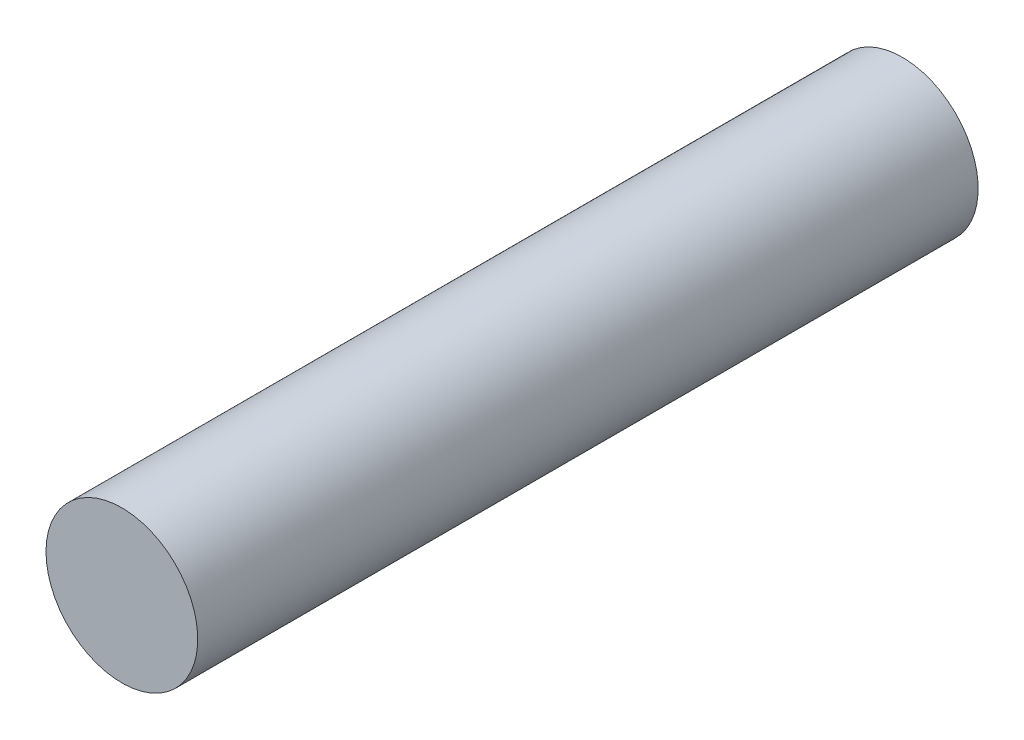
ISO-10303-21;
HEADER;
FILE_DESCRIPTION(('STEP AP214'),'2;1');
FILE_NAME('part.step','',(''),(''),'','','');
FILE_SCHEMA(('AUTOMOTIVE_DESIGN { 1 0 10303 214 1 1 1 1 }'));
ENDSEC;
DATA;
#1=APPLICATION_CONTEXT('core data for automotive mechanical design processes');
#2=APPLICATION_PROTOCOL_DEFINITION('international standard','automotive_design',2000,#1);
#3=PRODUCT_CONTEXT('',#1,'mechanical');
#4=PRODUCT('Part','Part','',(#3));
#5=PRODUCT_RELATED_PRODUCT_CATEGORY('part','',(#4));
#6=PRODUCT_DEFINITION_FORMATION('','',#4);
#7=PRODUCT_DEFINITION_CONTEXT('part definition',#1,'design');
#8=PRODUCT_DEFINITION('design','',#6,#7);
#9=PRODUCT_DEFINITION_SHAPE('','',#8);
#10=(LENGTH_UNIT() NAMED_UNIT(*) SI_UNIT(.MILLI.,.METRE.));
#11=(NAMED_UNIT(*) PLANE_ANGLE_UNIT() SI_UNIT($,.RADIAN.));
#12=(NAMED_UNIT(*) SI_UNIT($,.STERADIAN.) SOLID_ANGLE_UNIT());
#13=UNCERTAINTY_MEASURE_WITH_UNIT(LENGTH_MEASURE(1.E-05),#10,'distance_accuracy_value','');
#14=(GEOMETRIC_REPRESENTATION_CONTEXT(3) GLOBAL_UNCERTAINTY_ASSIGNED_CONTEXT((#13)) GLOBAL_UNIT_ASSIGNED_CONTEXT((#10,
#11,#12)) REPRESENTATION_CONTEXT('',''));
#15=CARTESIAN_POINT('',(0.,0.,0.));
#16=DIRECTION('',(0.,0.,1.));
#17=DIRECTION('',(1.,0.,0.));
#18=AXIS2_PLACEMENT_3D('',#15,#16,#17);
#19=CARTESIAN_POINT('',(0.,0.,180.));
#20=DIRECTION('',(0.,0.,-1.));
#21=DIRECTION('',(-1.,0.,0.));
#22=AXIS2_PLACEMENT_3D('',#19,#20,#21);
#23=CYLINDRICAL_SURFACE('',#22,17.5);
#24=CARTESIAN_POINT('',(0.,0.,180.));
#25=DIRECTION('',(0.,0.,1.));
#26=DIRECTION('',(1.,0.,0.));
#27=AXIS2_PLACEMENT_3D('',#24,#25,#26);
#28=CIRCLE('',#27,17.5);
#29=CARTESIAN_POINT('',(-17.5,0.,180.));
#30=VERTEX_POINT('',#29);
#31=EDGE_CURVE('E10',#30,#30,#28,.T.);
#32=CARTESIAN_POINT('',(0.,0.,0.));
#33=DIRECTION('',(0.,0.,1.));
#34=DIRECTION('',(1.,0.,0.));
#35=AXIS2_PLACEMENT_3D('',#32,#33,#34);
#36=CIRCLE('',#35,17.5);
#37=CARTESIAN_POINT('',(-17.5,0.,0.));
#38=VERTEX_POINT('',#37);
#39=EDGE_CURVE('E46',#38,#38,#36,.T.);
#40=CARTESIAN_POINT('',(-17.5,0.,180.));
#41=CARTESIAN_POINT('',(-17.5,0.,178.125));
#42=CARTESIAN_POINT('',(-17.5,0.,176.25));
#43=CARTESIAN_POINT('',(-17.5,0.,172.5));
#44=CARTESIAN_POINT('',(-17.5,0.,170.625));
#45=CARTESIAN_POINT('',(-17.5,0.,166.875));
#46=CARTESIAN_POINT('',(-17.5,0.,165.));
#47=CARTESIAN_POINT('',(-17.5,0.,161.25));
#48=CARTESIAN_POINT('',(-17.5,0.,159.375));
#49=CARTESIAN_POINT('',(-17.5,0.,155.625));
#50=CARTESIAN_POINT('',(-17.5,0.,153.75));
#51=CARTESIAN_POINT('',(-17.5,0.,150.));
#52=CARTESIAN_POINT('',(-17.5,0.,148.125));
#53=CARTESIAN_POINT('',(-17.5,0.,144.375));
#54=CARTESIAN_POINT('',(-17.5,0.,142.5));
#55=CARTESIAN_POINT('',(-17.5,0.,138.75));
#56=CARTESIAN_POINT('',(-17.5,0.,136.875));
#57=CARTESIAN_POINT('',(-17.5,0.,133.125));
#58=CARTESIAN_POINT('',(-17.5,0.,131.25));
#59=CARTESIAN_POINT('',(-17.5,0.,127.5));
#60=CARTESIAN_POINT('',(-17.5,0.,125.625));
#61=CARTESIAN_POINT('',(-17.5,0.,121.875));
#62=CARTESIAN_POINT('',(-17.5,0.,120.));
#63=CARTESIAN_POINT('',(-17.5,0.,116.25));
#64=CARTESIAN_POINT('',(-17.5,0.,114.375));
#65=CARTESIAN_POINT('',(-17.5,0.,110.625));
#66=CARTESIAN_POINT('',(-17.5,0.,108.75));
#67=CARTESIAN_POINT('',(-17.5,0.,105.));
#68=CARTESIAN_POINT('',(-17.5,0.,103.125));
#69=CARTESIAN_POINT('',(-17.5,0.,99.375));
#70=CARTESIAN_POINT('',(-17.5,0.,97.5));
#71=CARTESIAN_POINT('',(-17.5,0.,93.75));
#72=CARTESIAN_POINT('',(-17.5,0.,91.875));
#73=CARTESIAN_POINT('',(-17.5,0.,88.125));
#74=CARTESIAN_POINT('',(-17.5,0.,86.25));
#75=CARTESIAN_POINT('',(-17.5,0.,82.5));
#76=CARTESIAN_POINT('',(-17.5,0.,80.625));
#77=CARTESIAN_POINT('',(-17.5,0.,76.875));
#78=CARTESIAN_POINT('',(-17.5,0.,75.));
#79=CARTESIAN_POINT('',(-17.5,0.,71.25));
#80=CARTESIAN_POINT('',(-17.5,0.,69.375));
#81=CARTESIAN_POINT('',(-17.5,0.,65.625));
#82=CARTESIAN_POINT('',(-17.5,0.,63.75));
#83=CARTESIAN_POINT('',(-17.5,0.,60.));
#84=CARTESIAN_POINT('',(-17.5,0.,58.125));
#85=CARTESIAN_POINT('',(-17.5,0.,54.375));
#86=CARTESIAN_POINT('',(-17.5,0.,52.5));
#87=CARTESIAN_POINT('',(-17.5,0.,48.75));
#88=CARTESIAN_POINT('',(-17.5,0.,46.875));
#89=CARTESIAN_POINT('',(-17.5,0.,43.125));
#90=CARTESIAN_POINT('',(-17.5,0.,41.25));
#91=CARTESIAN_POINT('',(-17.5,0.,37.5));
#92=CARTESIAN_POINT('',(-17.5,0.,35.625));
#93=CARTESIAN_POINT('',(-17.5,0.,31.875));
#94=CARTESIAN_POINT('',(-17.5,0.,30.));
#95=CARTESIAN_POINT('',(-17.5,0.,26.25));
#96=CARTESIAN_POINT('',(-17.5,0.,24.375));
#97=CARTESIAN_POINT('',(-17.5,0.,20.625));
#98=CARTESIAN_POINT('',(-17.5,0.,18.75));
#99=CARTESIAN_POINT('',(-17.5,0.,15.));
#100=CARTESIAN_POINT('',(-17.5,0.,13.125));
#101=CARTESIAN_POINT('',(-17.5,0.,9.37499999999998));
#102=CARTESIAN_POINT('',(-17.5,0.,7.49999999999997));
#103=CARTESIAN_POINT('',(-17.5,0.,3.74999999999997));
#104=CARTESIAN_POINT('',(-17.5,0.,1.87499999999997));
#105=CARTESIAN_POINT('',(-17.5,0.,0.));
#106=B_SPLINE_CURVE_WITH_KNOTS('',3,(#40,#41,#42,#43,#44,#45,#46,#47,#48,#49,#50,#51,#52,#53,
#54,#55,#56,#57,#58,#59,#60,#61,#62,#63,#64,#65,#66,#67,#68,#69,#70,#71,#72,#73,#74,#75,#76,#77,
#78,#79,#80,#81,#82,#83,#84,#85,#86,#87,#88,#89,#90,#91,#92,#93,#94,#95,#96,#97,#98,#99,#100,
#101,#102,#103,#104,#105),.UNSPECIFIED.,.F.,.F.,(4,2,2,2,2,2,2,2,2,2,2,2,2,2,2,2,2,2,2,2,2,2,2,
2,2,2,2,2,2,2,2,2,4),(0.,5.62500000000002,11.25,16.875,22.5,28.125,33.75,39.375,45.,50.625,
56.25,61.875,67.5,73.125,78.75,84.375,90.,95.625,101.25,106.875,112.5,118.125,123.75,129.375,
135.,140.625,146.25,151.875,157.5,163.125,168.75,174.375,180.),.UNSPECIFIED.);
#107=EDGE_CURVE('BSEAM43',#30,#38,#106,.T.);
#108=ORIENTED_EDGE('',*,*,#31,.F.);
#109=ORIENTED_EDGE('',*,*,#39,.T.);
#110=ORIENTED_EDGE('',*,*,#107,.T.);
#111=ORIENTED_EDGE('',*,*,#107,.F.);
#112=EDGE_LOOP('',(#108,#110,#109,#111));
#113=FACE_BOUND('',#112,.T.);
#114=ADVANCED_FACE('F43',(#113),#23,.T.);
#115=CARTESIAN_POINT('',(0.,0.,180.));
#116=DIRECTION('',(0.,0.,1.));
#117=DIRECTION('',(1.,0.,0.));
#118=AXIS2_PLACEMENT_3D('',#115,#116,#117);
#119=PLANE('',#118);
#120=ORIENTED_EDGE('',*,*,#31,.T.);
#121=EDGE_LOOP('',(#120));
#122=FACE_BOUND('',#121,.T.);
#123=ADVANCED_FACE('F60',(#122),#119,.T.);
#124=CARTESIAN_POINT('',(0.,0.,0.));
#125=DIRECTION('',(0.,0.,1.));
#126=DIRECTION('',(1.,0.,0.));
#127=AXIS2_PLACEMENT_3D('',#124,#125,#126);
#128=PLANE('',#127);
#129=ORIENTED_EDGE('',*,*,#39,.F.);
#130=EDGE_LOOP('',(#129));
#131=FACE_BOUND('',#130,.T.);
#132=ADVANCED_FACE('F58',(#131),#128,.F.);
#133=CLOSED_SHELL('',(#114,#123,#132));
#134=MANIFOLD_SOLID_BREP('B2',#133);
#135=ADVANCED_BREP_SHAPE_REPRESENTATION('',(#18,#134),#14);
#136=SHAPE_DEFINITION_REPRESENTATION(#9,#135);
ENDSEC;
END-ISO-10303-21;
